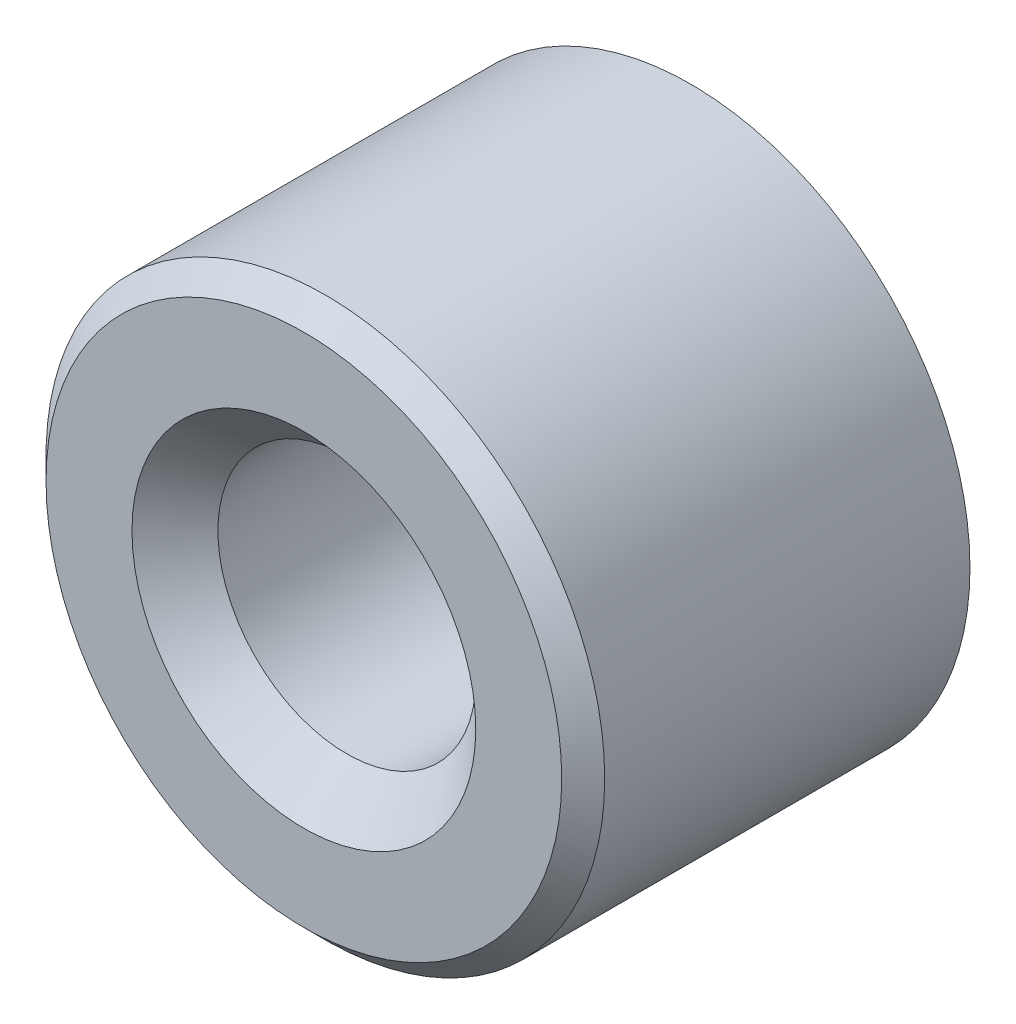
ISO-10303-21;
HEADER;
FILE_DESCRIPTION(('STEP AP214'),'2;1');
FILE_NAME('part.step','',(''),(''),'','','');
FILE_SCHEMA(('AUTOMOTIVE_DESIGN { 1 0 10303 214 1 1 1 1 }'));
ENDSEC;
DATA;
#1=APPLICATION_CONTEXT('core data for automotive mechanical design processes');
#2=APPLICATION_PROTOCOL_DEFINITION('international standard','automotive_design',2000,#1);
#3=PRODUCT_CONTEXT('',#1,'mechanical');
#4=PRODUCT('Part','Part','',(#3));
#5=PRODUCT_RELATED_PRODUCT_CATEGORY('part','',(#4));
#6=PRODUCT_DEFINITION_FORMATION('','',#4);
#7=PRODUCT_DEFINITION_CONTEXT('part definition',#1,'design');
#8=PRODUCT_DEFINITION('design','',#6,#7);
#9=PRODUCT_DEFINITION_SHAPE('','',#8);
#10=(LENGTH_UNIT() NAMED_UNIT(*) SI_UNIT(.MILLI.,.METRE.));
#11=(NAMED_UNIT(*) PLANE_ANGLE_UNIT() SI_UNIT($,.RADIAN.));
#12=(NAMED_UNIT(*) SI_UNIT($,.STERADIAN.) SOLID_ANGLE_UNIT());
#13=UNCERTAINTY_MEASURE_WITH_UNIT(LENGTH_MEASURE(1.E-05),#10,'distance_accuracy_value','');
#14=(GEOMETRIC_REPRESENTATION_CONTEXT(3) GLOBAL_UNCERTAINTY_ASSIGNED_CONTEXT((#13)) GLOBAL_UNIT_ASSIGNED_CONTEXT((#10,
#11,#12)) REPRESENTATION_CONTEXT('',''));
#15=CARTESIAN_POINT('',(0.,0.,0.));
#16=DIRECTION('',(0.,0.,1.));
#17=DIRECTION('',(1.,0.,0.));
#18=AXIS2_PLACEMENT_3D('',#15,#16,#17);
#19=CARTESIAN_POINT('',(135.,20.,-7.));
#20=DIRECTION('',(0.,0.,1.));
#21=DIRECTION('',(1.,0.,0.));
#22=AXIS2_PLACEMENT_3D('',#19,#20,#21);
#23=CYLINDRICAL_SURFACE('',#22,6.50000000000002);
#24=CARTESIAN_POINT('',(135.,20.,1.49999999999999));
#25=DIRECTION('',(0.,0.,1.));
#26=DIRECTION('',(1.,0.,0.));
#27=AXIS2_PLACEMENT_3D('',#24,#25,#26);
#28=CIRCLE('',#27,6.50000000000002);
#29=CARTESIAN_POINT('',(141.5,20.,1.49999999999999));
#30=VERTEX_POINT('',#29);
#31=EDGE_CURVE('E10',#30,#30,#28,.F.);
#32=ORIENTED_EDGE('',*,*,#31,.T.);
#33=EDGE_LOOP('',(#32));
#34=FACE_BOUND('',#33,.T.);
#35=CARTESIAN_POINT('',(135.,20.,-7.));
#36=DIRECTION('',(0.,0.,1.));
#37=DIRECTION('',(1.,0.,0.));
#38=AXIS2_PLACEMENT_3D('',#35,#36,#37);
#39=CIRCLE('',#38,6.50000000000002);
#40=CARTESIAN_POINT('',(141.5,20.,-7.));
#41=VERTEX_POINT('',#40);
#42=EDGE_CURVE('E53',#41,#41,#39,.T.);
#43=ORIENTED_EDGE('',*,*,#42,.T.);
#44=EDGE_LOOP('',(#43));
#45=FACE_BOUND('',#44,.T.);
#46=ADVANCED_FACE('F33',(#34,#45),#23,.T.);
#47=CARTESIAN_POINT('',(135.,20.,-7.));
#48=DIRECTION('',(0.,0.,1.));
#49=DIRECTION('',(1.,0.,0.));
#50=AXIS2_PLACEMENT_3D('',#47,#48,#49);
#51=PLANE('',#50);
#52=CARTESIAN_POINT('',(135.,20.,-7.));
#53=DIRECTION('',(0.,0.,1.));
#54=DIRECTION('',(1.,0.,0.));
#55=AXIS2_PLACEMENT_3D('',#52,#53,#54);
#56=CIRCLE('',#55,2.99999999999999);
#57=CARTESIAN_POINT('',(138.,20.,-7.));
#58=VERTEX_POINT('',#57);
#59=EDGE_CURVE('E56',#58,#58,#56,.T.);
#60=ORIENTED_EDGE('',*,*,#59,.T.);
#61=EDGE_LOOP('',(#60));
#62=FACE_BOUND('',#61,.T.);
#63=ORIENTED_EDGE('',*,*,#42,.F.);
#64=EDGE_LOOP('',(#63));
#65=FACE_BOUND('',#64,.T.);
#66=ADVANCED_FACE('F60',(#62,#65),#51,.F.);
#67=CARTESIAN_POINT('',(135.,20.,-7.));
#68=DIRECTION('',(0.,0.,1.));
#69=DIRECTION('',(1.,0.,0.));
#70=AXIS2_PLACEMENT_3D('',#67,#68,#69);
#71=CYLINDRICAL_SURFACE('',#70,2.99999999999999);
#72=CARTESIAN_POINT('',(135.,20.,0.99999999999999));
#73=DIRECTION('',(0.,0.,1.));
#74=DIRECTION('',(1.,0.,0.));
#75=AXIS2_PLACEMENT_3D('',#72,#73,#74);
#76=CIRCLE('',#75,2.99999999999999);
#77=CARTESIAN_POINT('',(138.,20.,0.99999999999999));
#78=VERTEX_POINT('',#77);
#79=EDGE_CURVE('E48',#78,#78,#76,.T.);
#80=ORIENTED_EDGE('',*,*,#79,.T.);
#81=EDGE_LOOP('',(#80));
#82=FACE_BOUND('',#81,.T.);
#83=ORIENTED_EDGE('',*,*,#59,.F.);
#84=EDGE_LOOP('',(#83));
#85=FACE_BOUND('',#84,.T.);
#86=ADVANCED_FACE('F63',(#82,#85),#71,.F.);
#87=CARTESIAN_POINT('',(135.,20.,2.));
#88=DIRECTION('',(0.,0.,1.));
#89=DIRECTION('',(1.,0.,0.));
#90=AXIS2_PLACEMENT_3D('',#87,#88,#89);
#91=PLANE('',#90);
#92=CARTESIAN_POINT('',(135.,20.,2.));
#93=DIRECTION('',(0.,0.,1.));
#94=DIRECTION('',(1.,0.,0.));
#95=AXIS2_PLACEMENT_3D('',#92,#93,#94);
#96=CIRCLE('',#95,6.00000000000001);
#97=CARTESIAN_POINT('',(141.,20.,2.));
#98=VERTEX_POINT('',#97);
#99=EDGE_CURVE('E40',#98,#98,#96,.T.);
#100=ORIENTED_EDGE('',*,*,#99,.T.);
#101=EDGE_LOOP('',(#100));
#102=FACE_BOUND('',#101,.T.);
#103=CARTESIAN_POINT('',(135.,20.,2.));
#104=DIRECTION('',(0.,0.,1.));
#105=DIRECTION('',(1.,0.,0.));
#106=AXIS2_PLACEMENT_3D('',#103,#104,#105);
#107=CIRCLE('',#106,4.);
#108=CARTESIAN_POINT('',(139.,20.,2.));
#109=VERTEX_POINT('',#108);
#110=EDGE_CURVE('E44',#109,#109,#107,.F.);
#111=ORIENTED_EDGE('',*,*,#110,.T.);
#112=EDGE_LOOP('',(#111));
#113=FACE_BOUND('',#112,.T.);
#114=ADVANCED_FACE('F65',(#102,#113),#91,.T.);
#115=CARTESIAN_POINT('',(135.,20.,0.99999999999999));
#116=DIRECTION('',(0.,0.,1.));
#117=DIRECTION('',(1.,0.,0.));
#118=AXIS2_PLACEMENT_3D('',#115,#116,#117);
#119=CONICAL_SURFACE('',#118,2.99999999999999,0.785398163397447);
#120=ORIENTED_EDGE('',*,*,#110,.F.);
#121=EDGE_LOOP('',(#120));
#122=FACE_BOUND('',#121,.T.);
#123=ORIENTED_EDGE('',*,*,#79,.F.);
#124=EDGE_LOOP('',(#123));
#125=FACE_BOUND('',#124,.T.);
#126=ADVANCED_FACE('F72',(#122,#125),#119,.F.);
#127=CARTESIAN_POINT('',(135.,20.,2.));
#128=DIRECTION('',(0.,0.,-1.));
#129=DIRECTION('',(-1.,0.,0.));
#130=AXIS2_PLACEMENT_3D('',#127,#128,#129);
#131=CONICAL_SURFACE('',#130,6.00000000000001,0.785398163397447);
#132=ORIENTED_EDGE('',*,*,#31,.F.);
#133=EDGE_LOOP('',(#132));
#134=FACE_BOUND('',#133,.T.);
#135=ORIENTED_EDGE('',*,*,#99,.F.);
#136=EDGE_LOOP('',(#135));
#137=FACE_BOUND('',#136,.T.);
#138=ADVANCED_FACE('F35',(#134,#137),#131,.T.);
#139=CLOSED_SHELL('',(#46,#66,#86,#114,#126,#138));
#140=MANIFOLD_SOLID_BREP('B2',#139);
#141=ADVANCED_BREP_SHAPE_REPRESENTATION('',(#18,#140),#14);
#142=SHAPE_DEFINITION_REPRESENTATION(#9,#141);
ENDSEC;
END-ISO-10303-21;
